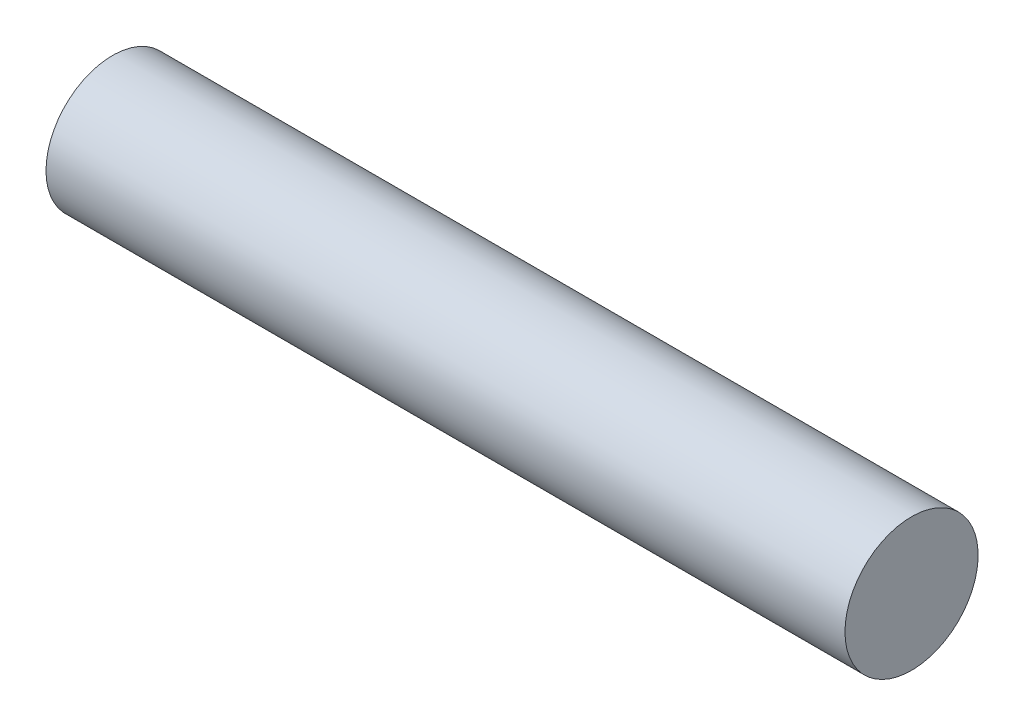
ISO-10303-21;
HEADER;
FILE_DESCRIPTION(('STEP AP214'),'2;1');
FILE_NAME('part.step','',(''),(''),'','','');
FILE_SCHEMA(('AUTOMOTIVE_DESIGN { 1 0 10303 214 1 1 1 1 }'));
ENDSEC;
DATA;
#1=APPLICATION_CONTEXT('core data for automotive mechanical design processes');
#2=APPLICATION_PROTOCOL_DEFINITION('international standard','automotive_design',2000,#1);
#3=PRODUCT_CONTEXT('',#1,'mechanical');
#4=PRODUCT('Part','Part','',(#3));
#5=PRODUCT_RELATED_PRODUCT_CATEGORY('part','',(#4));
#6=PRODUCT_DEFINITION_FORMATION('','',#4);
#7=PRODUCT_DEFINITION_CONTEXT('part definition',#1,'design');
#8=PRODUCT_DEFINITION('design','',#6,#7);
#9=PRODUCT_DEFINITION_SHAPE('','',#8);
#10=(LENGTH_UNIT() NAMED_UNIT(*) SI_UNIT(.MILLI.,.METRE.));
#11=(NAMED_UNIT(*) PLANE_ANGLE_UNIT() SI_UNIT($,.RADIAN.));
#12=(NAMED_UNIT(*) SI_UNIT($,.STERADIAN.) SOLID_ANGLE_UNIT());
#13=UNCERTAINTY_MEASURE_WITH_UNIT(LENGTH_MEASURE(1.E-05),#10,'distance_accuracy_value','');
#14=(GEOMETRIC_REPRESENTATION_CONTEXT(3) GLOBAL_UNCERTAINTY_ASSIGNED_CONTEXT((#13)) GLOBAL_UNIT_ASSIGNED_CONTEXT((#10,
#11,#12)) REPRESENTATION_CONTEXT('',''));
#15=CARTESIAN_POINT('',(0.,0.,0.));
#16=DIRECTION('',(0.,0.,1.));
#17=DIRECTION('',(1.,0.,0.));
#18=AXIS2_PLACEMENT_3D('',#15,#16,#17);
#19=CARTESIAN_POINT('',(76.2,0.,0.));
#20=DIRECTION('',(-1.,0.,0.));
#21=DIRECTION('',(0.,0.,1.));
#22=AXIS2_PLACEMENT_3D('',#19,#20,#21);
#23=CYLINDRICAL_SURFACE('',#22,6.35);
#24=CARTESIAN_POINT('',(76.2,0.,0.));
#25=DIRECTION('',(1.,0.,0.));
#26=DIRECTION('',(0.,0.,-1.));
#27=AXIS2_PLACEMENT_3D('',#24,#25,#26);
#28=CIRCLE('',#27,6.35);
#29=CARTESIAN_POINT('',(76.2,0.,6.35));
#30=VERTEX_POINT('',#29);
#31=EDGE_CURVE('E12',#30,#30,#28,.T.);
#32=CARTESIAN_POINT('',(0.,0.,0.));
#33=DIRECTION('',(1.,0.,0.));
#34=DIRECTION('',(0.,0.,-1.));
#35=AXIS2_PLACEMENT_3D('',#32,#33,#34);
#36=CIRCLE('',#35,6.35);
#37=CARTESIAN_POINT('',(0.,0.,6.35));
#38=VERTEX_POINT('',#37);
#39=EDGE_CURVE('E43',#38,#38,#36,.T.);
#40=CARTESIAN_POINT('',(76.2,0.,6.35));
#41=CARTESIAN_POINT('',(75.40625,0.,6.35));
#42=CARTESIAN_POINT('',(74.6125,0.,6.35));
#43=CARTESIAN_POINT('',(73.025,0.,6.35));
#44=CARTESIAN_POINT('',(72.23125,0.,6.35));
#45=CARTESIAN_POINT('',(70.64375,0.,6.35));
#46=CARTESIAN_POINT('',(69.85,0.,6.35));
#47=CARTESIAN_POINT('',(68.2625,0.,6.35));
#48=CARTESIAN_POINT('',(67.46875,0.,6.35));
#49=CARTESIAN_POINT('',(65.88125,0.,6.35));
#50=CARTESIAN_POINT('',(65.0875,0.,6.35));
#51=CARTESIAN_POINT('',(63.5,0.,6.35));
#52=CARTESIAN_POINT('',(62.70625,0.,6.35));
#53=CARTESIAN_POINT('',(61.11875,0.,6.35));
#54=CARTESIAN_POINT('',(60.325,0.,6.35));
#55=CARTESIAN_POINT('',(58.7375,0.,6.35));
#56=CARTESIAN_POINT('',(57.94375,0.,6.35));
#57=CARTESIAN_POINT('',(56.35625,0.,6.35));
#58=CARTESIAN_POINT('',(55.5625,0.,6.35));
#59=CARTESIAN_POINT('',(53.975,0.,6.35));
#60=CARTESIAN_POINT('',(53.18125,0.,6.35));
#61=CARTESIAN_POINT('',(51.59375,0.,6.35));
#62=CARTESIAN_POINT('',(50.8,0.,6.35));
#63=CARTESIAN_POINT('',(49.2125,0.,6.35));
#64=CARTESIAN_POINT('',(48.41875,0.,6.35));
#65=CARTESIAN_POINT('',(46.83125,0.,6.35));
#66=CARTESIAN_POINT('',(46.0375,0.,6.35));
#67=CARTESIAN_POINT('',(44.45,0.,6.35));
#68=CARTESIAN_POINT('',(43.65625,0.,6.35));
#69=CARTESIAN_POINT('',(42.06875,0.,6.35));
#70=CARTESIAN_POINT('',(41.275,0.,6.35));
#71=CARTESIAN_POINT('',(39.6875,0.,6.35));
#72=CARTESIAN_POINT('',(38.89375,0.,6.35));
#73=CARTESIAN_POINT('',(37.30625,0.,6.35));
#74=CARTESIAN_POINT('',(36.5125,0.,6.35));
#75=CARTESIAN_POINT('',(34.925,0.,6.35));
#76=CARTESIAN_POINT('',(34.13125,0.,6.35));
#77=CARTESIAN_POINT('',(32.54375,0.,6.35));
#78=CARTESIAN_POINT('',(31.75,0.,6.35));
#79=CARTESIAN_POINT('',(30.1625,0.,6.35));
#80=CARTESIAN_POINT('',(29.36875,0.,6.35));
#81=CARTESIAN_POINT('',(27.78125,0.,6.35));
#82=CARTESIAN_POINT('',(26.9875,0.,6.35));
#83=CARTESIAN_POINT('',(25.4,0.,6.35));
#84=CARTESIAN_POINT('',(24.60625,0.,6.35));
#85=CARTESIAN_POINT('',(23.01875,0.,6.35));
#86=CARTESIAN_POINT('',(22.225,0.,6.35));
#87=CARTESIAN_POINT('',(20.6375,0.,6.35));
#88=CARTESIAN_POINT('',(19.84375,0.,6.35));
#89=CARTESIAN_POINT('',(18.25625,0.,6.35));
#90=CARTESIAN_POINT('',(17.4625,0.,6.35));
#91=CARTESIAN_POINT('',(15.875,0.,6.35));
#92=CARTESIAN_POINT('',(15.08125,0.,6.35));
#93=CARTESIAN_POINT('',(13.49375,0.,6.35));
#94=CARTESIAN_POINT('',(12.7,0.,6.35));
#95=CARTESIAN_POINT('',(11.1125,0.,6.35));
#96=CARTESIAN_POINT('',(10.31875,0.,6.35));
#97=CARTESIAN_POINT('',(8.73125,0.,6.35));
#98=CARTESIAN_POINT('',(7.93750000000001,0.,6.35));
#99=CARTESIAN_POINT('',(6.35,0.,6.35));
#100=CARTESIAN_POINT('',(5.55625,0.,6.35));
#101=CARTESIAN_POINT('',(3.96875,0.,6.35));
#102=CARTESIAN_POINT('',(3.175,0.,6.35));
#103=CARTESIAN_POINT('',(1.5875,0.,6.35));
#104=CARTESIAN_POINT('',(0.793750000000001,0.,6.35));
#105=CARTESIAN_POINT('',(0.,0.,6.35));
#106=B_SPLINE_CURVE_WITH_KNOTS('',3,(#40,#41,#42,#43,#44,#45,#46,#47,#48,#49,#50,#51,#52,#53,
#54,#55,#56,#57,#58,#59,#60,#61,#62,#63,#64,#65,#66,#67,#68,#69,#70,#71,#72,#73,#74,#75,#76,#77,
#78,#79,#80,#81,#82,#83,#84,#85,#86,#87,#88,#89,#90,#91,#92,#93,#94,#95,#96,#97,#98,#99,#100,
#101,#102,#103,#104,#105),.UNSPECIFIED.,.F.,.F.,(4,2,2,2,2,2,2,2,2,2,2,2,2,2,2,2,2,2,2,2,2,2,2,
2,2,2,2,2,2,2,2,2,4),(0.,2.38124999999999,4.76249999999999,7.14374999999999,9.52499999999999,
11.90625,14.2875,16.66875,19.05,21.43125,23.8125,26.19375,28.575,30.95625,33.3375,35.71875,38.1,
40.48125,42.8625,45.24375,47.625,50.00625,52.3875,54.76875,57.15,59.53125,61.9125,64.29375,
66.675,69.05625,71.4375,73.81875,76.2),.UNSPECIFIED.);
#107=EDGE_CURVE('BSEAM40',#30,#38,#106,.T.);
#108=ORIENTED_EDGE('',*,*,#31,.F.);
#109=ORIENTED_EDGE('',*,*,#39,.T.);
#110=ORIENTED_EDGE('',*,*,#107,.T.);
#111=ORIENTED_EDGE('',*,*,#107,.F.);
#112=EDGE_LOOP('',(#108,#110,#109,#111));
#113=FACE_BOUND('',#112,.T.);
#114=ADVANCED_FACE('F40',(#113),#23,.T.);
#115=CARTESIAN_POINT('',(76.2,0.,0.));
#116=DIRECTION('',(1.,0.,0.));
#117=DIRECTION('',(0.,0.,-1.));
#118=AXIS2_PLACEMENT_3D('',#115,#116,#117);
#119=PLANE('',#118);
#120=ORIENTED_EDGE('',*,*,#31,.T.);
#121=EDGE_LOOP('',(#120));
#122=FACE_BOUND('',#121,.T.);
#123=ADVANCED_FACE('F55',(#122),#119,.T.);
#124=CARTESIAN_POINT('',(0.,0.,0.));
#125=DIRECTION('',(1.,0.,0.));
#126=DIRECTION('',(0.,0.,-1.));
#127=AXIS2_PLACEMENT_3D('',#124,#125,#126);
#128=PLANE('',#127);
#129=ORIENTED_EDGE('',*,*,#39,.F.);
#130=EDGE_LOOP('',(#129));
#131=FACE_BOUND('',#130,.T.);
#132=ADVANCED_FACE('F53',(#131),#128,.F.);
#133=CLOSED_SHELL('',(#114,#123,#132));
#134=MANIFOLD_SOLID_BREP('B2',#133);
#135=ADVANCED_BREP_SHAPE_REPRESENTATION('',(#18,#134),#14);
#136=SHAPE_DEFINITION_REPRESENTATION(#9,#135);
ENDSEC;
END-ISO-10303-21;
